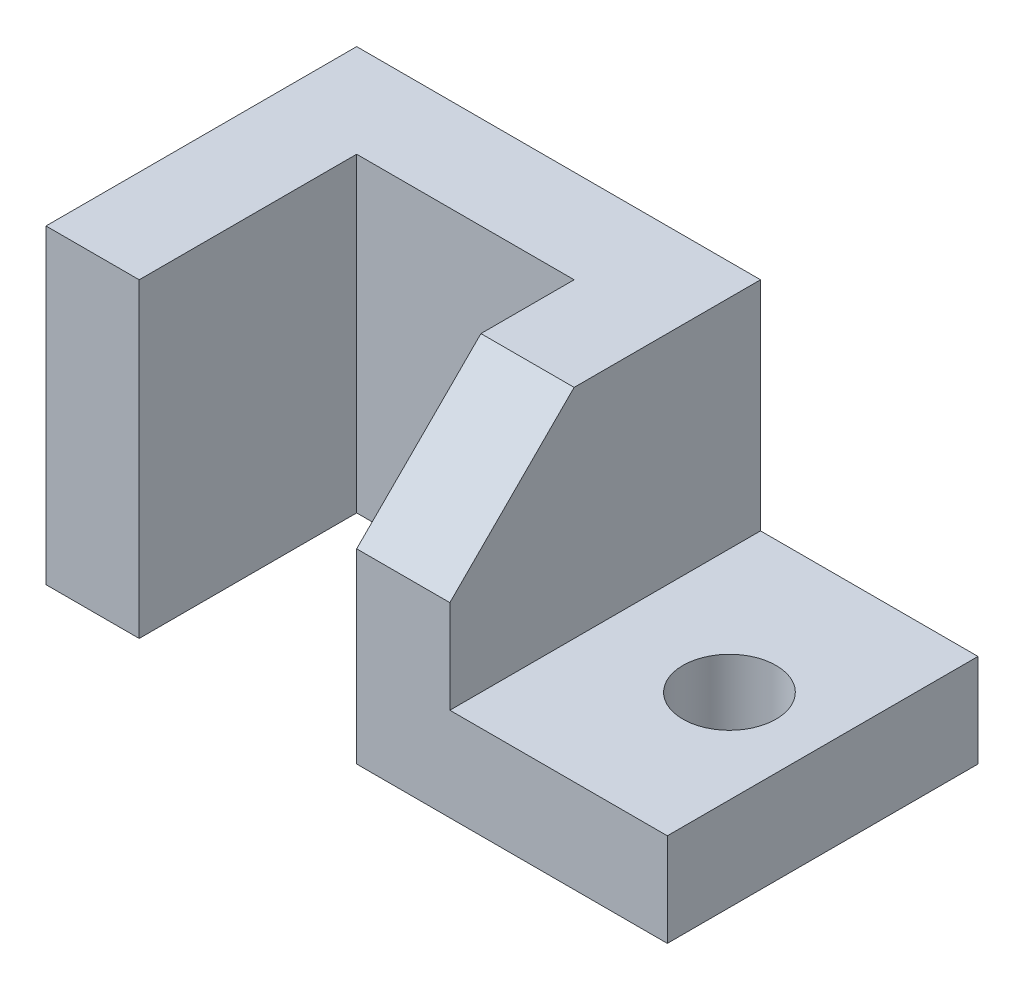
ISO-10303-21;
HEADER;
FILE_DESCRIPTION(('STEP AP214'),'2;1');
FILE_NAME('part.step','',(''),(''),'','','');
FILE_SCHEMA(('AUTOMOTIVE_DESIGN { 1 0 10303 214 1 1 1 1 }'));
ENDSEC;
DATA;
#1=APPLICATION_CONTEXT('core data for automotive mechanical design processes');
#2=APPLICATION_PROTOCOL_DEFINITION('international standard','automotive_design',2000,#1);
#3=PRODUCT_CONTEXT('',#1,'mechanical');
#4=PRODUCT('Part','Part','',(#3));
#5=PRODUCT_RELATED_PRODUCT_CATEGORY('part','',(#4));
#6=PRODUCT_DEFINITION_FORMATION('','',#4);
#7=PRODUCT_DEFINITION_CONTEXT('part definition',#1,'design');
#8=PRODUCT_DEFINITION('design','',#6,#7);
#9=PRODUCT_DEFINITION_SHAPE('','',#8);
#10=(LENGTH_UNIT() NAMED_UNIT(*) SI_UNIT(.MILLI.,.METRE.));
#11=(NAMED_UNIT(*) PLANE_ANGLE_UNIT() SI_UNIT($,.RADIAN.));
#12=(NAMED_UNIT(*) SI_UNIT($,.STERADIAN.) SOLID_ANGLE_UNIT());
#13=UNCERTAINTY_MEASURE_WITH_UNIT(LENGTH_MEASURE(1.E-05),#10,'distance_accuracy_value','');
#14=(GEOMETRIC_REPRESENTATION_CONTEXT(3) GLOBAL_UNCERTAINTY_ASSIGNED_CONTEXT((#13)) GLOBAL_UNIT_ASSIGNED_CONTEXT((#10,
#11,#12)) REPRESENTATION_CONTEXT('',''));
#15=CARTESIAN_POINT('',(0.,0.,0.));
#16=DIRECTION('',(0.,0.,1.));
#17=DIRECTION('',(1.,0.,0.));
#18=AXIS2_PLACEMENT_3D('',#15,#16,#17);
#19=CARTESIAN_POINT('',(0.,0.,63.5));
#20=DIRECTION('',(1.,0.,0.));
#21=DIRECTION('',(0.,0.,-1.));
#22=AXIS2_PLACEMENT_3D('',#19,#20,#21);
#23=PLANE('',#22);
#24=DIRECTION('',(0.,-1.,0.));
#25=VECTOR('',#24,1.);
#26=CARTESIAN_POINT('',(0.,0.,63.5));
#27=LINE('',#26,#25);
#28=CARTESIAN_POINT('',(0.,38.0999999999999,63.5));
#29=VERTEX_POINT('',#28);
#30=CARTESIAN_POINT('',(0.,0.,63.5));
#31=VERTEX_POINT('',#30);
#32=EDGE_CURVE('E132',#29,#31,#27,.T.);
#33=ORIENTED_EDGE('',*,*,#32,.F.);
#34=DIRECTION('',(0.,-0.707106781186549,0.707106781186546));
#35=VECTOR('',#34,1.);
#36=CARTESIAN_POINT('',(0.,63.5,38.1));
#37=LINE('',#36,#35);
#38=CARTESIAN_POINT('',(0.,63.5,38.1));
#39=VERTEX_POINT('',#38);
#40=EDGE_CURVE('E54',#39,#29,#37,.T.);
#41=ORIENTED_EDGE('',*,*,#40,.F.);
#42=DIRECTION('',(0.,0.,-1.));
#43=VECTOR('',#42,1.);
#44=CARTESIAN_POINT('',(0.,63.5,63.5));
#45=LINE('',#44,#43);
#46=CARTESIAN_POINT('',(0.,63.5,19.05));
#47=VERTEX_POINT('',#46);
#48=EDGE_CURVE('E131',#39,#47,#45,.T.);
#49=ORIENTED_EDGE('',*,*,#48,.T.);
#50=DIRECTION('',(0.,1.,0.));
#51=VECTOR('',#50,1.);
#52=CARTESIAN_POINT('',(0.,0.,19.05));
#53=LINE('',#52,#51);
#54=CARTESIAN_POINT('',(0.,0.,19.05));
#55=VERTEX_POINT('',#54);
#56=EDGE_CURVE('E62',#55,#47,#53,.T.);
#57=ORIENTED_EDGE('',*,*,#56,.F.);
#58=DIRECTION('',(0.,0.,-1.));
#59=VECTOR('',#58,1.);
#60=CARTESIAN_POINT('',(0.,0.,63.5));
#61=LINE('',#60,#59);
#62=EDGE_CURVE('E11',#31,#55,#61,.T.);
#63=ORIENTED_EDGE('',*,*,#62,.F.);
#64=EDGE_LOOP('',(#33,#41,#49,#57,#63));
#65=FACE_BOUND('',#64,.T.);
#66=ADVANCED_FACE('F39',(#65),#23,.F.);
#67=CARTESIAN_POINT('',(63.5,0.,63.5));
#68=DIRECTION('',(0.,1.,0.));
#69=DIRECTION('',(-1.,0.,0.));
#70=AXIS2_PLACEMENT_3D('',#67,#68,#69);
#71=PLANE('',#70);
#72=CARTESIAN_POINT('',(44.45,0.,31.75));
#73=DIRECTION('',(0.,1.,0.));
#74=DIRECTION('',(-1.,0.,0.));
#75=AXIS2_PLACEMENT_3D('',#72,#73,#74);
#76=CIRCLE('',#75,9.525);
#77=CARTESIAN_POINT('',(34.925,0.,31.75));
#78=VERTEX_POINT('',#77);
#79=EDGE_CURVE('E220',#78,#78,#76,.T.);
#80=ORIENTED_EDGE('',*,*,#79,.T.);
#81=EDGE_LOOP('',(#80));
#82=FACE_BOUND('',#81,.T.);
#83=DIRECTION('',(1.,0.,0.));
#84=VECTOR('',#83,1.);
#85=CARTESIAN_POINT('',(63.5,0.,0.));
#86=LINE('',#85,#84);
#87=CARTESIAN_POINT('',(-63.5,0.,0.));
#88=VERTEX_POINT('',#87);
#89=CARTESIAN_POINT('',(63.5,0.,0.));
#90=VERTEX_POINT('',#89);
#91=EDGE_CURVE('E178',#88,#90,#86,.T.);
#92=ORIENTED_EDGE('',*,*,#91,.T.);
#93=DIRECTION('',(0.,0.,-1.));
#94=VECTOR('',#93,1.);
#95=CARTESIAN_POINT('',(63.5,0.,63.5));
#96=LINE('',#95,#94);
#97=CARTESIAN_POINT('',(63.5,0.,63.5));
#98=VERTEX_POINT('',#97);
#99=EDGE_CURVE('E47',#98,#90,#96,.T.);
#100=ORIENTED_EDGE('',*,*,#99,.F.);
#101=DIRECTION('',(1.,0.,0.));
#102=VECTOR('',#101,1.);
#103=CARTESIAN_POINT('',(63.5,0.,63.5));
#104=LINE('',#103,#102);
#105=EDGE_CURVE('E196',#31,#98,#104,.T.);
#106=ORIENTED_EDGE('',*,*,#105,.F.);
#107=ORIENTED_EDGE('',*,*,#62,.T.);
#108=DIRECTION('',(1.,0.,0.));
#109=VECTOR('',#108,1.);
#110=CARTESIAN_POINT('',(-44.45,0.,19.05));
#111=LINE('',#110,#109);
#112=CARTESIAN_POINT('',(-44.45,0.,19.05));
#113=VERTEX_POINT('',#112);
#114=EDGE_CURVE('E240',#113,#55,#111,.T.);
#115=ORIENTED_EDGE('',*,*,#114,.F.);
#116=DIRECTION('',(0.,0.,-1.));
#117=VECTOR('',#116,1.);
#118=CARTESIAN_POINT('',(-44.45,0.,63.5));
#119=LINE('',#118,#117);
#120=CARTESIAN_POINT('',(-44.45,0.,63.5));
#121=VERTEX_POINT('',#120);
#122=EDGE_CURVE('E236',#121,#113,#119,.T.);
#123=ORIENTED_EDGE('',*,*,#122,.F.);
#124=DIRECTION('',(1.,0.,0.));
#125=VECTOR('',#124,1.);
#126=CARTESIAN_POINT('',(-63.5,0.,63.5));
#127=LINE('',#126,#125);
#128=CARTESIAN_POINT('',(-63.5,0.,63.5));
#129=VERTEX_POINT('',#128);
#130=EDGE_CURVE('E232',#129,#121,#127,.T.);
#131=ORIENTED_EDGE('',*,*,#130,.F.);
#132=DIRECTION('',(0.,0.,1.));
#133=VECTOR('',#132,1.);
#134=CARTESIAN_POINT('',(-63.5,0.,0.));
#135=LINE('',#134,#133);
#136=EDGE_CURVE('E228',#88,#129,#135,.T.);
#137=ORIENTED_EDGE('',*,*,#136,.F.);
#138=EDGE_LOOP('',(#92,#100,#106,#107,#115,#123,#131,#137));
#139=FACE_BOUND('',#138,.T.);
#140=ADVANCED_FACE('F280',(#82,#139),#71,.F.);
#141=CARTESIAN_POINT('',(63.5,19.05,63.5));
#142=DIRECTION('',(-1.,0.,0.));
#143=DIRECTION('',(0.,0.,1.));
#144=AXIS2_PLACEMENT_3D('',#141,#142,#143);
#145=PLANE('',#144);
#146=DIRECTION('',(0.,1.,0.));
#147=VECTOR('',#146,1.);
#148=CARTESIAN_POINT('',(63.5,19.05,0.));
#149=LINE('',#148,#147);
#150=CARTESIAN_POINT('',(63.5,19.05,0.));
#151=VERTEX_POINT('',#150);
#152=EDGE_CURVE('E170',#90,#151,#149,.T.);
#153=ORIENTED_EDGE('',*,*,#152,.T.);
#154=DIRECTION('',(0.,0.,-1.));
#155=VECTOR('',#154,1.);
#156=CARTESIAN_POINT('',(63.5,19.05,63.5));
#157=LINE('',#156,#155);
#158=CARTESIAN_POINT('',(63.5,19.05,63.5));
#159=VERTEX_POINT('',#158);
#160=EDGE_CURVE('E159',#159,#151,#157,.T.);
#161=ORIENTED_EDGE('',*,*,#160,.F.);
#162=DIRECTION('',(0.,1.,0.));
#163=VECTOR('',#162,1.);
#164=CARTESIAN_POINT('',(63.5,19.05,63.5));
#165=LINE('',#164,#163);
#166=EDGE_CURVE('E171',#98,#159,#165,.T.);
#167=ORIENTED_EDGE('',*,*,#166,.F.);
#168=ORIENTED_EDGE('',*,*,#99,.T.);
#169=EDGE_LOOP('',(#153,#161,#167,#168));
#170=FACE_BOUND('',#169,.T.);
#171=ADVANCED_FACE('F168',(#170),#145,.F.);
#172=CARTESIAN_POINT('',(19.05,19.05,63.5));
#173=DIRECTION('',(0.,-1.,0.));
#174=DIRECTION('',(1.,0.,0.));
#175=AXIS2_PLACEMENT_3D('',#172,#173,#174);
#176=PLANE('',#175);
#177=CARTESIAN_POINT('',(44.45,19.05,31.75));
#178=DIRECTION('',(0.,1.,0.));
#179=DIRECTION('',(-1.,0.,0.));
#180=AXIS2_PLACEMENT_3D('',#177,#178,#179);
#181=CIRCLE('',#180,9.525);
#182=CARTESIAN_POINT('',(34.925,19.05,31.75));
#183=VERTEX_POINT('',#182);
#184=EDGE_CURVE('E134',#183,#183,#181,.T.);
#185=ORIENTED_EDGE('',*,*,#184,.F.);
#186=EDGE_LOOP('',(#185));
#187=FACE_BOUND('',#186,.T.);
#188=DIRECTION('',(-1.,0.,0.));
#189=VECTOR('',#188,1.);
#190=CARTESIAN_POINT('',(19.05,19.05,0.));
#191=LINE('',#190,#189);
#192=CARTESIAN_POINT('',(19.05,19.05,0.));
#193=VERTEX_POINT('',#192);
#194=EDGE_CURVE('E181',#151,#193,#191,.T.);
#195=ORIENTED_EDGE('',*,*,#194,.T.);
#196=DIRECTION('',(0.,0.,-1.));
#197=VECTOR('',#196,1.);
#198=CARTESIAN_POINT('',(19.05,19.05,63.5));
#199=LINE('',#198,#197);
#200=CARTESIAN_POINT('',(19.05,19.05,63.5));
#201=VERTEX_POINT('',#200);
#202=EDGE_CURVE('E147',#201,#193,#199,.T.);
#203=ORIENTED_EDGE('',*,*,#202,.F.);
#204=DIRECTION('',(-1.,0.,0.));
#205=VECTOR('',#204,1.);
#206=CARTESIAN_POINT('',(19.05,19.05,63.5));
#207=LINE('',#206,#205);
#208=EDGE_CURVE('E150',#159,#201,#207,.T.);
#209=ORIENTED_EDGE('',*,*,#208,.F.);
#210=ORIENTED_EDGE('',*,*,#160,.T.);
#211=EDGE_LOOP('',(#195,#203,#209,#210));
#212=FACE_BOUND('',#211,.T.);
#213=ADVANCED_FACE('F213',(#187,#212),#176,.F.);
#214=CARTESIAN_POINT('',(19.05,63.5,63.5));
#215=DIRECTION('',(-1.,0.,0.));
#216=DIRECTION('',(0.,-1.,0.));
#217=AXIS2_PLACEMENT_3D('',#214,#215,#216);
#218=PLANE('',#217);
#219=DIRECTION('',(0.,0.,-1.));
#220=VECTOR('',#219,1.);
#221=CARTESIAN_POINT('',(19.05,63.5,63.5));
#222=LINE('',#221,#220);
#223=CARTESIAN_POINT('',(19.05,63.5,38.1));
#224=VERTEX_POINT('',#223);
#225=CARTESIAN_POINT('',(19.05,63.5,0.));
#226=VERTEX_POINT('',#225);
#227=EDGE_CURVE('E142',#224,#226,#222,.T.);
#228=ORIENTED_EDGE('',*,*,#227,.F.);
#229=DIRECTION('',(0.,0.707106781186549,-0.707106781186546));
#230=VECTOR('',#229,1.);
#231=CARTESIAN_POINT('',(19.05,63.5,38.1));
#232=LINE('',#231,#230);
#233=CARTESIAN_POINT('',(19.05,38.0999999999999,63.5));
#234=VERTEX_POINT('',#233);
#235=EDGE_CURVE('E123',#234,#224,#232,.T.);
#236=ORIENTED_EDGE('',*,*,#235,.F.);
#237=DIRECTION('',(0.,1.,0.));
#238=VECTOR('',#237,1.);
#239=CARTESIAN_POINT('',(19.05,63.5,63.5));
#240=LINE('',#239,#238);
#241=EDGE_CURVE('E143',#201,#234,#240,.T.);
#242=ORIENTED_EDGE('',*,*,#241,.F.);
#243=ORIENTED_EDGE('',*,*,#202,.T.);
#244=DIRECTION('',(0.,1.,0.));
#245=VECTOR('',#244,1.);
#246=CARTESIAN_POINT('',(19.05,63.5,0.));
#247=LINE('',#246,#245);
#248=EDGE_CURVE('E186',#193,#226,#247,.T.);
#249=ORIENTED_EDGE('',*,*,#248,.T.);
#250=EDGE_LOOP('',(#228,#236,#242,#243,#249));
#251=FACE_BOUND('',#250,.T.);
#252=ADVANCED_FACE('F214',(#251),#218,.F.);
#253=CARTESIAN_POINT('',(0.,63.5,63.5));
#254=DIRECTION('',(0.,-1.,0.));
#255=DIRECTION('',(0.,0.,-1.));
#256=AXIS2_PLACEMENT_3D('',#253,#254,#255);
#257=PLANE('',#256);
#258=ORIENTED_EDGE('',*,*,#48,.F.);
#259=DIRECTION('',(1.,0.,0.));
#260=VECTOR('',#259,1.);
#261=CARTESIAN_POINT('',(-63.501,63.5,38.1));
#262=LINE('',#261,#260);
#263=EDGE_CURVE('E120',#39,#224,#262,.T.);
#264=ORIENTED_EDGE('',*,*,#263,.T.);
#265=ORIENTED_EDGE('',*,*,#227,.T.);
#266=DIRECTION('',(-1.,0.,0.));
#267=VECTOR('',#266,1.);
#268=CARTESIAN_POINT('',(0.,63.5,0.));
#269=LINE('',#268,#267);
#270=CARTESIAN_POINT('',(-63.5,63.5,0.));
#271=VERTEX_POINT('',#270);
#272=EDGE_CURVE('E153',#226,#271,#269,.T.);
#273=ORIENTED_EDGE('',*,*,#272,.T.);
#274=DIRECTION('',(0.,0.,1.));
#275=VECTOR('',#274,1.);
#276=CARTESIAN_POINT('',(-63.5,63.5,0.));
#277=LINE('',#276,#275);
#278=CARTESIAN_POINT('',(-63.5,63.5,63.5));
#279=VERTEX_POINT('',#278);
#280=EDGE_CURVE('E224',#271,#279,#277,.T.);
#281=ORIENTED_EDGE('',*,*,#280,.T.);
#282=DIRECTION('',(1.,0.,0.));
#283=VECTOR('',#282,1.);
#284=CARTESIAN_POINT('',(-63.5,63.5,63.5));
#285=LINE('',#284,#283);
#286=CARTESIAN_POINT('',(-44.45,63.5,63.5));
#287=VERTEX_POINT('',#286);
#288=EDGE_CURVE('E246',#279,#287,#285,.T.);
#289=ORIENTED_EDGE('',*,*,#288,.T.);
#290=DIRECTION('',(0.,0.,-1.));
#291=VECTOR('',#290,1.);
#292=CARTESIAN_POINT('',(-44.45,63.5,63.5));
#293=LINE('',#292,#291);
#294=CARTESIAN_POINT('',(-44.45,63.5,19.05));
#295=VERTEX_POINT('',#294);
#296=EDGE_CURVE('E250',#287,#295,#293,.T.);
#297=ORIENTED_EDGE('',*,*,#296,.T.);
#298=DIRECTION('',(1.,0.,0.));
#299=VECTOR('',#298,1.);
#300=CARTESIAN_POINT('',(-44.45,63.5,19.05));
#301=LINE('',#300,#299);
#302=EDGE_CURVE('E140',#295,#47,#301,.T.);
#303=ORIENTED_EDGE('',*,*,#302,.T.);
#304=EDGE_LOOP('',(#258,#264,#265,#273,#281,#289,#297,#303));
#305=FACE_BOUND('',#304,.T.);
#306=ADVANCED_FACE('F137',(#305),#257,.F.);
#307=CARTESIAN_POINT('',(0.,0.,63.5));
#308=DIRECTION('',(0.,0.,-1.));
#309=DIRECTION('',(-1.,0.,0.));
#310=AXIS2_PLACEMENT_3D('',#307,#308,#309);
#311=PLANE('',#310);
#312=ORIENTED_EDGE('',*,*,#241,.T.);
#313=DIRECTION('',(1.,0.,0.));
#314=VECTOR('',#313,1.);
#315=CARTESIAN_POINT('',(-63.501,38.0999999999999,63.5));
#316=LINE('',#315,#314);
#317=EDGE_CURVE('E128',#29,#234,#316,.T.);
#318=ORIENTED_EDGE('',*,*,#317,.F.);
#319=ORIENTED_EDGE('',*,*,#32,.T.);
#320=ORIENTED_EDGE('',*,*,#105,.T.);
#321=ORIENTED_EDGE('',*,*,#166,.T.);
#322=ORIENTED_EDGE('',*,*,#208,.T.);
#323=EDGE_LOOP('',(#312,#318,#319,#320,#321,#322));
#324=FACE_BOUND('',#323,.T.);
#325=ADVANCED_FACE('F210',(#324),#311,.F.);
#326=CARTESIAN_POINT('',(0.,0.,0.));
#327=DIRECTION('',(0.,0.,-1.));
#328=DIRECTION('',(-1.,0.,0.));
#329=AXIS2_PLACEMENT_3D('',#326,#327,#328);
#330=PLANE('',#329);
#331=ORIENTED_EDGE('',*,*,#91,.F.);
#332=DIRECTION('',(0.,1.,0.));
#333=VECTOR('',#332,1.);
#334=CARTESIAN_POINT('',(-63.5,0.,0.));
#335=LINE('',#334,#333);
#336=EDGE_CURVE('E202',#88,#271,#335,.T.);
#337=ORIENTED_EDGE('',*,*,#336,.T.);
#338=ORIENTED_EDGE('',*,*,#272,.F.);
#339=ORIENTED_EDGE('',*,*,#248,.F.);
#340=ORIENTED_EDGE('',*,*,#194,.F.);
#341=ORIENTED_EDGE('',*,*,#152,.F.);
#342=EDGE_LOOP('',(#331,#337,#338,#339,#340,#341));
#343=FACE_BOUND('',#342,.T.);
#344=ADVANCED_FACE('F176',(#343),#330,.T.);
#345=CARTESIAN_POINT('',(-44.45,0.,19.05));
#346=DIRECTION('',(0.,0.,1.));
#347=DIRECTION('',(1.,0.,0.));
#348=AXIS2_PLACEMENT_3D('',#345,#346,#347);
#349=PLANE('',#348);
#350=ORIENTED_EDGE('',*,*,#302,.F.);
#351=DIRECTION('',(0.,1.,0.));
#352=VECTOR('',#351,1.);
#353=CARTESIAN_POINT('',(-44.45,0.,19.05));
#354=LINE('',#353,#352);
#355=EDGE_CURVE('E257',#113,#295,#354,.T.);
#356=ORIENTED_EDGE('',*,*,#355,.F.);
#357=ORIENTED_EDGE('',*,*,#114,.T.);
#358=ORIENTED_EDGE('',*,*,#56,.T.);
#359=EDGE_LOOP('',(#350,#356,#357,#358));
#360=FACE_BOUND('',#359,.T.);
#361=ADVANCED_FACE('F279',(#360),#349,.T.);
#362=CARTESIAN_POINT('',(-44.45,0.,63.5));
#363=DIRECTION('',(1.,0.,0.));
#364=DIRECTION('',(0.,0.,-1.));
#365=AXIS2_PLACEMENT_3D('',#362,#363,#364);
#366=PLANE('',#365);
#367=ORIENTED_EDGE('',*,*,#296,.F.);
#368=DIRECTION('',(0.,1.,0.));
#369=VECTOR('',#368,1.);
#370=CARTESIAN_POINT('',(-44.45,0.,63.5));
#371=LINE('',#370,#369);
#372=EDGE_CURVE('E260',#121,#287,#371,.T.);
#373=ORIENTED_EDGE('',*,*,#372,.F.);
#374=ORIENTED_EDGE('',*,*,#122,.T.);
#375=ORIENTED_EDGE('',*,*,#355,.T.);
#376=EDGE_LOOP('',(#367,#373,#374,#375));
#377=FACE_BOUND('',#376,.T.);
#378=ADVANCED_FACE('F276',(#377),#366,.T.);
#379=CARTESIAN_POINT('',(-63.5,0.,63.5));
#380=DIRECTION('',(0.,0.,1.));
#381=DIRECTION('',(1.,0.,0.));
#382=AXIS2_PLACEMENT_3D('',#379,#380,#381);
#383=PLANE('',#382);
#384=ORIENTED_EDGE('',*,*,#288,.F.);
#385=DIRECTION('',(0.,1.,0.));
#386=VECTOR('',#385,1.);
#387=CARTESIAN_POINT('',(-63.5,0.,63.5));
#388=LINE('',#387,#386);
#389=EDGE_CURVE('E262',#129,#279,#388,.T.);
#390=ORIENTED_EDGE('',*,*,#389,.F.);
#391=ORIENTED_EDGE('',*,*,#130,.T.);
#392=ORIENTED_EDGE('',*,*,#372,.T.);
#393=EDGE_LOOP('',(#384,#390,#391,#392));
#394=FACE_BOUND('',#393,.T.);
#395=ADVANCED_FACE('F272',(#394),#383,.T.);
#396=CARTESIAN_POINT('',(-63.5,0.,0.));
#397=DIRECTION('',(-1.,0.,0.));
#398=DIRECTION('',(0.,0.,1.));
#399=AXIS2_PLACEMENT_3D('',#396,#397,#398);
#400=PLANE('',#399);
#401=ORIENTED_EDGE('',*,*,#280,.F.);
#402=ORIENTED_EDGE('',*,*,#336,.F.);
#403=ORIENTED_EDGE('',*,*,#136,.T.);
#404=ORIENTED_EDGE('',*,*,#389,.T.);
#405=EDGE_LOOP('',(#401,#402,#403,#404));
#406=FACE_BOUND('',#405,.T.);
#407=ADVANCED_FACE('F269',(#406),#400,.T.);
#408=CARTESIAN_POINT('',(44.45,0.,31.75));
#409=DIRECTION('',(0.,1.,0.));
#410=DIRECTION('',(-1.,0.,0.));
#411=AXIS2_PLACEMENT_3D('',#408,#409,#410);
#412=CYLINDRICAL_SURFACE('',#411,9.525);
#413=ORIENTED_EDGE('',*,*,#79,.F.);
#414=EDGE_LOOP('',(#413));
#415=FACE_BOUND('',#414,.T.);
#416=ORIENTED_EDGE('',*,*,#184,.T.);
#417=EDGE_LOOP('',(#416));
#418=FACE_BOUND('',#417,.T.);
#419=ADVANCED_FACE('F302',(#415,#418),#412,.F.);
#420=CARTESIAN_POINT('',(-63.501,63.5,38.1));
#421=DIRECTION('',(0.,-0.707106781186546,-0.707106781186549));
#422=DIRECTION('',(0.,0.707106781186549,-0.707106781186546));
#423=AXIS2_PLACEMENT_3D('',#420,#421,#422);
#424=PLANE('',#423);
#425=ORIENTED_EDGE('',*,*,#40,.T.);
#426=ORIENTED_EDGE('',*,*,#317,.T.);
#427=ORIENTED_EDGE('',*,*,#235,.T.);
#428=ORIENTED_EDGE('',*,*,#263,.F.);
#429=EDGE_LOOP('',(#425,#426,#427,#428));
#430=FACE_BOUND('',#429,.T.);
#431=ADVANCED_FACE('F121',(#430),#424,.F.);
#432=CLOSED_SHELL('',(#66,#140,#171,#213,#252,#306,#325,#344,#361,#378,#395,#407,#419,#431));
#433=MANIFOLD_SOLID_BREP('B2',#432);
#434=ADVANCED_BREP_SHAPE_REPRESENTATION('',(#18,#433),#14);
#435=SHAPE_DEFINITION_REPRESENTATION(#9,#434);
ENDSEC;
END-ISO-10303-21;
